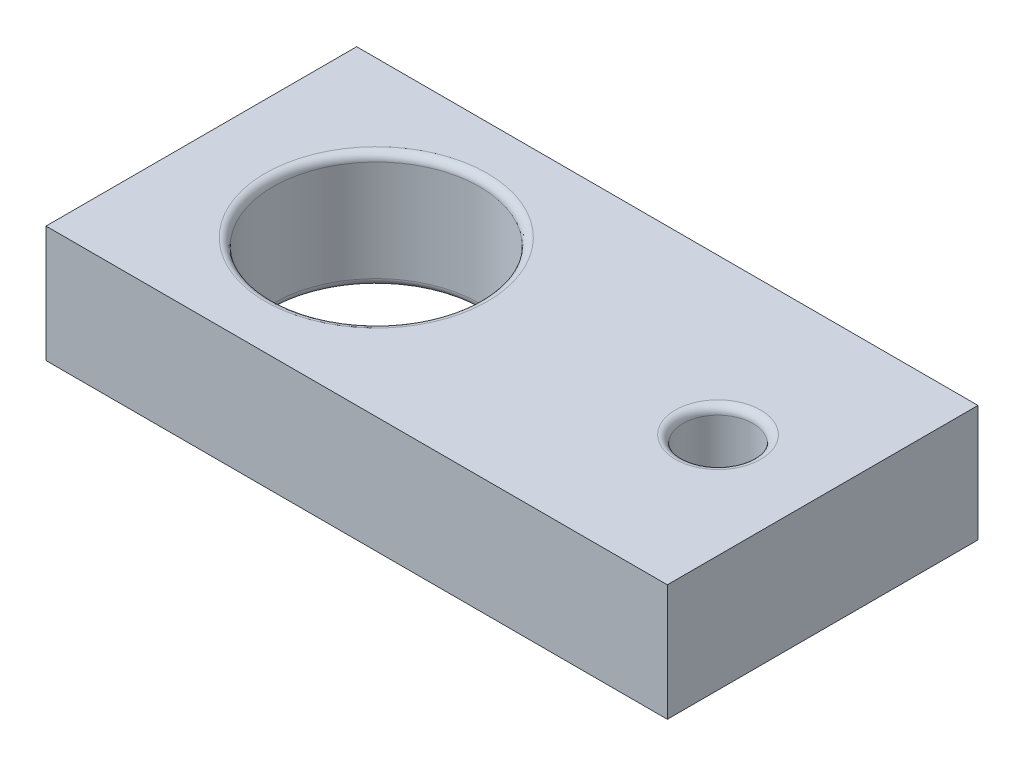
ISO-10303-21;
HEADER;
FILE_DESCRIPTION(('STEP AP214'),'2;1');
FILE_NAME('part.step','',(''),(''),'','','');
FILE_SCHEMA(('AUTOMOTIVE_DESIGN { 1 0 10303 214 1 1 1 1 }'));
ENDSEC;
DATA;
#1=APPLICATION_CONTEXT('core data for automotive mechanical design processes');
#2=APPLICATION_PROTOCOL_DEFINITION('international standard','automotive_design',2000,#1);
#3=PRODUCT_CONTEXT('',#1,'mechanical');
#4=PRODUCT('Part','Part','',(#3));
#5=PRODUCT_RELATED_PRODUCT_CATEGORY('part','',(#4));
#6=PRODUCT_DEFINITION_FORMATION('','',#4);
#7=PRODUCT_DEFINITION_CONTEXT('part definition',#1,'design');
#8=PRODUCT_DEFINITION('design','',#6,#7);
#9=PRODUCT_DEFINITION_SHAPE('','',#8);
#10=(LENGTH_UNIT() NAMED_UNIT(*) SI_UNIT(.MILLI.,.METRE.));
#11=(NAMED_UNIT(*) PLANE_ANGLE_UNIT() SI_UNIT($,.RADIAN.));
#12=(NAMED_UNIT(*) SI_UNIT($,.STERADIAN.) SOLID_ANGLE_UNIT());
#13=UNCERTAINTY_MEASURE_WITH_UNIT(LENGTH_MEASURE(1.E-05),#10,'distance_accuracy_value','');
#14=(GEOMETRIC_REPRESENTATION_CONTEXT(3) GLOBAL_UNCERTAINTY_ASSIGNED_CONTEXT((#13)) GLOBAL_UNIT_ASSIGNED_CONTEXT((#10,
#11,#12)) REPRESENTATION_CONTEXT('',''));
#15=CARTESIAN_POINT('',(0.,0.,0.));
#16=DIRECTION('',(0.,0.,1.));
#17=DIRECTION('',(1.,0.,0.));
#18=AXIS2_PLACEMENT_3D('',#15,#16,#17);
#19=CARTESIAN_POINT('',(0.,15.,0.));
#20=DIRECTION('',(0.,0.,-1.));
#21=DIRECTION('',(-1.,0.,0.));
#22=AXIS2_PLACEMENT_3D('',#19,#20,#21);
#23=PLANE('',#22);
#24=DIRECTION('',(1.,0.,0.));
#25=VECTOR('',#24,1.);
#26=CARTESIAN_POINT('',(0.,0.,0.));
#27=LINE('',#26,#25);
#28=CARTESIAN_POINT('',(40.,0.,0.));
#29=VERTEX_POINT('',#28);
#30=CARTESIAN_POINT('',(120.,0.,0.));
#31=VERTEX_POINT('',#30);
#32=EDGE_CURVE('E85',#29,#31,#27,.T.);
#33=ORIENTED_EDGE('',*,*,#32,.T.);
#34=DIRECTION('',(0.,1.,0.));
#35=VECTOR('',#34,1.);
#36=CARTESIAN_POINT('',(120.,0.,0.));
#37=LINE('',#36,#35);
#38=CARTESIAN_POINT('',(120.,15.,0.));
#39=VERTEX_POINT('',#38);
#40=EDGE_CURVE('E46',#31,#39,#37,.T.);
#41=ORIENTED_EDGE('',*,*,#40,.T.);
#42=DIRECTION('',(1.,0.,0.));
#43=VECTOR('',#42,1.);
#44=CARTESIAN_POINT('',(0.,15.,0.));
#45=LINE('',#44,#43);
#46=CARTESIAN_POINT('',(40.,15.,0.));
#47=VERTEX_POINT('',#46);
#48=EDGE_CURVE('E83',#47,#39,#45,.T.);
#49=ORIENTED_EDGE('',*,*,#48,.F.);
#50=DIRECTION('',(0.,1.,0.));
#51=VECTOR('',#50,1.);
#52=CARTESIAN_POINT('',(40.,0.,0.));
#53=LINE('',#52,#51);
#54=EDGE_CURVE('E178',#29,#47,#53,.T.);
#55=ORIENTED_EDGE('',*,*,#54,.F.);
#56=EDGE_LOOP('',(#33,#41,#49,#55));
#57=FACE_BOUND('',#56,.T.);
#58=ADVANCED_FACE('F32',(#57),#23,.F.);
#59=CARTESIAN_POINT('',(0.,15.,-40.));
#60=DIRECTION('',(0.,0.,1.));
#61=DIRECTION('',(1.,0.,0.));
#62=AXIS2_PLACEMENT_3D('',#59,#60,#61);
#63=PLANE('',#62);
#64=DIRECTION('',(-1.,0.,0.));
#65=VECTOR('',#64,1.);
#66=CARTESIAN_POINT('',(0.,15.,-40.));
#67=LINE('',#66,#65);
#68=CARTESIAN_POINT('',(120.,15.,-40.));
#69=VERTEX_POINT('',#68);
#70=CARTESIAN_POINT('',(40.,15.,-40.));
#71=VERTEX_POINT('',#70);
#72=EDGE_CURVE('E91',#69,#71,#67,.T.);
#73=ORIENTED_EDGE('',*,*,#72,.F.);
#74=DIRECTION('',(0.,-1.,0.));
#75=VECTOR('',#74,1.);
#76=CARTESIAN_POINT('',(120.,15.,-40.));
#77=LINE('',#76,#75);
#78=CARTESIAN_POINT('',(120.,0.,-40.));
#79=VERTEX_POINT('',#78);
#80=EDGE_CURVE('E74',#69,#79,#77,.T.);
#81=ORIENTED_EDGE('',*,*,#80,.T.);
#82=DIRECTION('',(-1.,0.,0.));
#83=VECTOR('',#82,1.);
#84=CARTESIAN_POINT('',(0.,0.,-40.));
#85=LINE('',#84,#83);
#86=CARTESIAN_POINT('',(40.,0.,-40.));
#87=VERTEX_POINT('',#86);
#88=EDGE_CURVE('E54',#79,#87,#85,.T.);
#89=ORIENTED_EDGE('',*,*,#88,.T.);
#90=DIRECTION('',(0.,1.,0.));
#91=VECTOR('',#90,1.);
#92=CARTESIAN_POINT('',(40.,15.,-40.));
#93=LINE('',#92,#91);
#94=EDGE_CURVE('E97',#87,#71,#93,.T.);
#95=ORIENTED_EDGE('',*,*,#94,.T.);
#96=EDGE_LOOP('',(#73,#81,#89,#95));
#97=FACE_BOUND('',#96,.T.);
#98=ADVANCED_FACE('F148',(#97),#63,.F.);
#99=CARTESIAN_POINT('',(0.,15.,0.));
#100=DIRECTION('',(0.,-1.,0.));
#101=DIRECTION('',(0.,0.,-1.));
#102=AXIS2_PLACEMENT_3D('',#99,#100,#101);
#103=PLANE('',#102);
#104=CARTESIAN_POINT('',(106.526668527053,15.,-20.));
#105=DIRECTION('',(0.,-1.,0.));
#106=DIRECTION('',(0.,0.,-1.));
#107=AXIS2_PLACEMENT_3D('',#104,#105,#106);
#108=CIRCLE('',#107,5.50000000000001);
#109=CARTESIAN_POINT('',(106.526668527053,15.,-25.5));
#110=VERTEX_POINT('',#109);
#111=EDGE_CURVE('E40',#110,#110,#108,.T.);
#112=ORIENTED_EDGE('',*,*,#111,.T.);
#113=EDGE_LOOP('',(#112));
#114=FACE_BOUND('',#113,.T.);
#115=CARTESIAN_POINT('',(62.5266685270529,15.,-20.));
#116=DIRECTION('',(0.,-1.,0.));
#117=DIRECTION('',(0.,0.,-1.));
#118=AXIS2_PLACEMENT_3D('',#115,#116,#117);
#119=CIRCLE('',#118,14.3);
#120=CARTESIAN_POINT('',(62.5266685270529,15.,-34.3));
#121=VERTEX_POINT('',#120);
#122=EDGE_CURVE('E118',#121,#121,#119,.T.);
#123=ORIENTED_EDGE('',*,*,#122,.T.);
#124=EDGE_LOOP('',(#123));
#125=FACE_BOUND('',#124,.T.);
#126=ORIENTED_EDGE('',*,*,#48,.T.);
#127=DIRECTION('',(0.,0.,1.));
#128=VECTOR('',#127,1.);
#129=CARTESIAN_POINT('',(120.,15.,0.));
#130=LINE('',#129,#128);
#131=EDGE_CURVE('E72',#69,#39,#130,.T.);
#132=ORIENTED_EDGE('',*,*,#131,.F.);
#133=ORIENTED_EDGE('',*,*,#72,.T.);
#134=DIRECTION('',(0.,0.,-1.));
#135=VECTOR('',#134,1.);
#136=CARTESIAN_POINT('',(40.,15.,0.));
#137=LINE('',#136,#135);
#138=EDGE_CURVE('E90',#47,#71,#137,.T.);
#139=ORIENTED_EDGE('',*,*,#138,.F.);
#140=EDGE_LOOP('',(#126,#132,#133,#139));
#141=FACE_BOUND('',#140,.T.);
#142=ADVANCED_FACE('F88',(#114,#125,#141),#103,.F.);
#143=CARTESIAN_POINT('',(0.,0.,0.));
#144=DIRECTION('',(0.,-1.,0.));
#145=DIRECTION('',(0.,0.,-1.));
#146=AXIS2_PLACEMENT_3D('',#143,#144,#145);
#147=PLANE('',#146);
#148=DIRECTION('',(0.,0.,-1.));
#149=VECTOR('',#148,1.);
#150=CARTESIAN_POINT('',(120.,0.,0.));
#151=LINE('',#150,#149);
#152=EDGE_CURVE('E11',#31,#79,#151,.T.);
#153=ORIENTED_EDGE('',*,*,#152,.F.);
#154=ORIENTED_EDGE('',*,*,#32,.F.);
#155=DIRECTION('',(0.,0.,-1.));
#156=VECTOR('',#155,1.);
#157=CARTESIAN_POINT('',(40.,0.,0.));
#158=LINE('',#157,#156);
#159=EDGE_CURVE('E175',#29,#87,#158,.T.);
#160=ORIENTED_EDGE('',*,*,#159,.T.);
#161=ORIENTED_EDGE('',*,*,#88,.F.);
#162=EDGE_LOOP('',(#153,#154,#160,#161));
#163=FACE_BOUND('',#162,.T.);
#164=CARTESIAN_POINT('',(62.5266685270529,0.,-20.));
#165=DIRECTION('',(0.,-1.,0.));
#166=DIRECTION('',(0.,0.,-1.));
#167=AXIS2_PLACEMENT_3D('',#164,#165,#166);
#168=CIRCLE('',#167,14.3);
#169=CARTESIAN_POINT('',(62.5266685270529,0.,-34.3));
#170=VERTEX_POINT('',#169);
#171=EDGE_CURVE('E103',#170,#170,#168,.F.);
#172=ORIENTED_EDGE('',*,*,#171,.T.);
#173=EDGE_LOOP('',(#172));
#174=FACE_BOUND('',#173,.T.);
#175=CARTESIAN_POINT('',(106.526668527053,0.,-20.));
#176=DIRECTION('',(0.,-1.,0.));
#177=DIRECTION('',(0.,0.,-1.));
#178=AXIS2_PLACEMENT_3D('',#175,#176,#177);
#179=CIRCLE('',#178,5.50000000000001);
#180=CARTESIAN_POINT('',(106.526668527053,0.,-25.5));
#181=VERTEX_POINT('',#180);
#182=EDGE_CURVE('E93',#181,#181,#179,.F.);
#183=ORIENTED_EDGE('',*,*,#182,.T.);
#184=EDGE_LOOP('',(#183));
#185=FACE_BOUND('',#184,.T.);
#186=ADVANCED_FACE('F143',(#163,#174,#185),#147,.T.);
#187=CARTESIAN_POINT('',(62.5266685270529,0.,-20.));
#188=DIRECTION('',(0.,1.,0.));
#189=DIRECTION('',(0.,0.,1.));
#190=AXIS2_PLACEMENT_3D('',#187,#188,#189);
#191=CYLINDRICAL_SURFACE('',#190,13.3);
#192=CARTESIAN_POINT('',(62.5266685270529,1.,-20.));
#193=DIRECTION('',(0.,-1.,0.));
#194=DIRECTION('',(0.,0.,-1.));
#195=AXIS2_PLACEMENT_3D('',#192,#193,#194);
#196=CIRCLE('',#195,13.3);
#197=CARTESIAN_POINT('',(62.5266685270529,1.,-33.3));
#198=VERTEX_POINT('',#197);
#199=EDGE_CURVE('E109',#198,#198,#196,.T.);
#200=ORIENTED_EDGE('',*,*,#199,.T.);
#201=EDGE_LOOP('',(#200));
#202=FACE_BOUND('',#201,.T.);
#203=CARTESIAN_POINT('',(62.5266685270529,14.,-20.));
#204=DIRECTION('',(0.,-1.,0.));
#205=DIRECTION('',(0.,0.,-1.));
#206=AXIS2_PLACEMENT_3D('',#203,#204,#205);
#207=CIRCLE('',#206,13.3);
#208=CARTESIAN_POINT('',(62.5266685270529,14.,-33.3));
#209=VERTEX_POINT('',#208);
#210=EDGE_CURVE('E106',#209,#209,#207,.F.);
#211=ORIENTED_EDGE('',*,*,#210,.T.);
#212=EDGE_LOOP('',(#211));
#213=FACE_BOUND('',#212,.T.);
#214=ADVANCED_FACE('F134',(#202,#213),#191,.F.);
#215=CARTESIAN_POINT('',(106.526668527053,0.,-20.));
#216=DIRECTION('',(0.,1.,0.));
#217=DIRECTION('',(0.,0.,1.));
#218=AXIS2_PLACEMENT_3D('',#215,#216,#217);
#219=CYLINDRICAL_SURFACE('',#218,4.5);
#220=CARTESIAN_POINT('',(106.526668527053,1.,-20.));
#221=DIRECTION('',(0.,-1.,0.));
#222=DIRECTION('',(0.,0.,-1.));
#223=AXIS2_PLACEMENT_3D('',#220,#221,#222);
#224=CIRCLE('',#223,4.5);
#225=CARTESIAN_POINT('',(106.526668527053,1.,-24.5));
#226=VERTEX_POINT('',#225);
#227=EDGE_CURVE('E115',#226,#226,#224,.T.);
#228=ORIENTED_EDGE('',*,*,#227,.T.);
#229=EDGE_LOOP('',(#228));
#230=FACE_BOUND('',#229,.T.);
#231=CARTESIAN_POINT('',(106.526668527053,14.,-20.));
#232=DIRECTION('',(0.,-1.,0.));
#233=DIRECTION('',(0.,0.,-1.));
#234=AXIS2_PLACEMENT_3D('',#231,#232,#233);
#235=CIRCLE('',#234,4.5);
#236=CARTESIAN_POINT('',(106.526668527053,14.,-24.5));
#237=VERTEX_POINT('',#236);
#238=EDGE_CURVE('E112',#237,#237,#235,.F.);
#239=ORIENTED_EDGE('',*,*,#238,.T.);
#240=EDGE_LOOP('',(#239));
#241=FACE_BOUND('',#240,.T.);
#242=ADVANCED_FACE('F131',(#230,#241),#219,.F.);
#243=CARTESIAN_POINT('',(62.5266685270529,1.,-20.));
#244=DIRECTION('',(0.,-1.,0.));
#245=DIRECTION('',(0.,0.,-1.));
#246=AXIS2_PLACEMENT_3D('',#243,#244,#245);
#247=TOROIDAL_SURFACE('',#246,14.3,1.);
#248=ORIENTED_EDGE('',*,*,#199,.F.);
#249=EDGE_LOOP('',(#248));
#250=FACE_BOUND('',#249,.T.);
#251=ORIENTED_EDGE('',*,*,#171,.F.);
#252=EDGE_LOOP('',(#251));
#253=FACE_BOUND('',#252,.T.);
#254=ADVANCED_FACE('F133',(#250,#253),#247,.T.);
#255=CARTESIAN_POINT('',(106.526668527053,1.,-20.));
#256=DIRECTION('',(0.,-1.,0.));
#257=DIRECTION('',(0.,0.,-1.));
#258=AXIS2_PLACEMENT_3D('',#255,#256,#257);
#259=TOROIDAL_SURFACE('',#258,5.50000000000001,1.);
#260=ORIENTED_EDGE('',*,*,#227,.F.);
#261=EDGE_LOOP('',(#260));
#262=FACE_BOUND('',#261,.T.);
#263=ORIENTED_EDGE('',*,*,#182,.F.);
#264=EDGE_LOOP('',(#263));
#265=FACE_BOUND('',#264,.T.);
#266=ADVANCED_FACE('F128',(#262,#265),#259,.T.);
#267=CARTESIAN_POINT('',(106.526668527053,14.,-20.));
#268=DIRECTION('',(0.,-1.,0.));
#269=DIRECTION('',(0.,0.,-1.));
#270=AXIS2_PLACEMENT_3D('',#267,#268,#269);
#271=TOROIDAL_SURFACE('',#270,5.50000000000001,1.);
#272=ORIENTED_EDGE('',*,*,#111,.F.);
#273=EDGE_LOOP('',(#272));
#274=FACE_BOUND('',#273,.T.);
#275=ORIENTED_EDGE('',*,*,#238,.F.);
#276=EDGE_LOOP('',(#275));
#277=FACE_BOUND('',#276,.T.);
#278=ADVANCED_FACE('F125',(#274,#277),#271,.T.);
#279=CARTESIAN_POINT('',(62.5266685270529,14.,-20.));
#280=DIRECTION('',(0.,-1.,0.));
#281=DIRECTION('',(0.,0.,-1.));
#282=AXIS2_PLACEMENT_3D('',#279,#280,#281);
#283=TOROIDAL_SURFACE('',#282,14.3,1.);
#284=ORIENTED_EDGE('',*,*,#122,.F.);
#285=EDGE_LOOP('',(#284));
#286=FACE_BOUND('',#285,.T.);
#287=ORIENTED_EDGE('',*,*,#210,.F.);
#288=EDGE_LOOP('',(#287));
#289=FACE_BOUND('',#288,.T.);
#290=ADVANCED_FACE('F34',(#286,#289),#283,.T.);
#291=CARTESIAN_POINT('',(40.,0.,0.));
#292=DIRECTION('',(1.,0.,0.));
#293=DIRECTION('',(0.,0.,-1.));
#294=AXIS2_PLACEMENT_3D('',#291,#292,#293);
#295=PLANE('',#294);
#296=ORIENTED_EDGE('',*,*,#159,.F.);
#297=ORIENTED_EDGE('',*,*,#54,.T.);
#298=ORIENTED_EDGE('',*,*,#138,.T.);
#299=ORIENTED_EDGE('',*,*,#94,.F.);
#300=EDGE_LOOP('',(#296,#297,#298,#299));
#301=FACE_BOUND('',#300,.T.);
#302=ADVANCED_FACE('F180',(#301),#295,.F.);
#303=CARTESIAN_POINT('',(120.,0.,0.));
#304=DIRECTION('',(-1.,0.,0.));
#305=DIRECTION('',(0.,0.,1.));
#306=AXIS2_PLACEMENT_3D('',#303,#304,#305);
#307=PLANE('',#306);
#308=ORIENTED_EDGE('',*,*,#131,.T.);
#309=ORIENTED_EDGE('',*,*,#40,.F.);
#310=ORIENTED_EDGE('',*,*,#152,.T.);
#311=ORIENTED_EDGE('',*,*,#80,.F.);
#312=EDGE_LOOP('',(#308,#309,#310,#311));
#313=FACE_BOUND('',#312,.T.);
#314=ADVANCED_FACE('F73',(#313),#307,.F.);
#315=CLOSED_SHELL('',(#58,#98,#142,#186,#214,#242,#254,#266,#278,#290,#302,#314));
#316=MANIFOLD_SOLID_BREP('B2',#315);
#317=ADVANCED_BREP_SHAPE_REPRESENTATION('',(#18,#316),#14);
#318=SHAPE_DEFINITION_REPRESENTATION(#9,#317);
ENDSEC;
END-ISO-10303-21;
